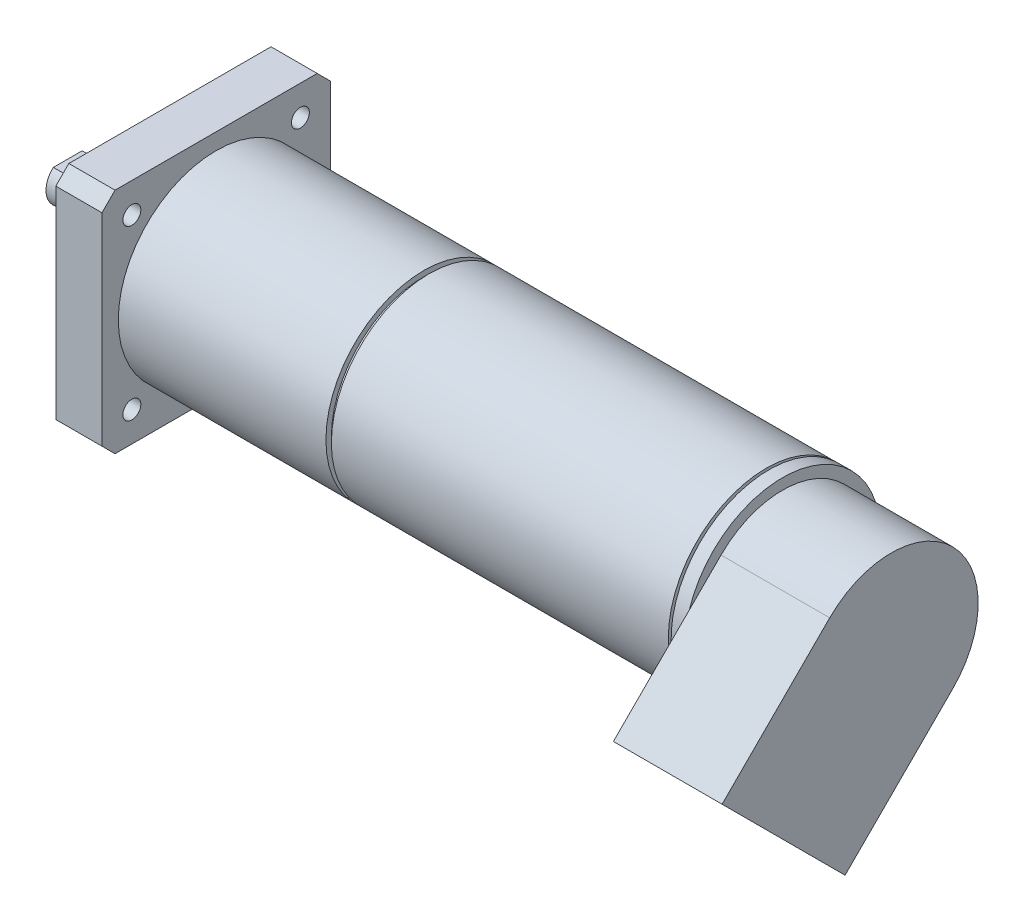
ISO-10303-21;
HEADER;
FILE_DESCRIPTION(('STEP AP214'),'2;1');
FILE_NAME('part.step','',(''),(''),'','','');
FILE_SCHEMA(('AUTOMOTIVE_DESIGN { 1 0 10303 214 1 1 1 1 }'));
ENDSEC;
DATA;
#1=APPLICATION_CONTEXT('core data for automotive mechanical design processes');
#2=APPLICATION_PROTOCOL_DEFINITION('international standard','automotive_design',2000,#1);
#3=PRODUCT_CONTEXT('',#1,'mechanical');
#4=PRODUCT('Part','Part','',(#3));
#5=PRODUCT_RELATED_PRODUCT_CATEGORY('part','',(#4));
#6=PRODUCT_DEFINITION_FORMATION('','',#4);
#7=PRODUCT_DEFINITION_CONTEXT('part definition',#1,'design');
#8=PRODUCT_DEFINITION('design','',#6,#7);
#9=PRODUCT_DEFINITION_SHAPE('','',#8);
#10=(LENGTH_UNIT() NAMED_UNIT(*) SI_UNIT(.MILLI.,.METRE.));
#11=(NAMED_UNIT(*) PLANE_ANGLE_UNIT() SI_UNIT($,.RADIAN.));
#12=(NAMED_UNIT(*) SI_UNIT($,.STERADIAN.) SOLID_ANGLE_UNIT());
#13=UNCERTAINTY_MEASURE_WITH_UNIT(LENGTH_MEASURE(1.E-05),#10,'distance_accuracy_value','');
#14=(GEOMETRIC_REPRESENTATION_CONTEXT(3) GLOBAL_UNCERTAINTY_ASSIGNED_CONTEXT((#13)) GLOBAL_UNIT_ASSIGNED_CONTEXT((#10,
#11,#12)) REPRESENTATION_CONTEXT('',''));
#15=CARTESIAN_POINT('',(0.,0.,0.));
#16=DIRECTION('',(0.,0.,1.));
#17=DIRECTION('',(1.,0.,0.));
#18=AXIS2_PLACEMENT_3D('',#15,#16,#17);
#19=CARTESIAN_POINT('',(-42.4116882454314,0.,0.));
#20=DIRECTION('',(1.,0.,0.));
#21=DIRECTION('',(0.,0.,-1.));
#22=AXIS2_PLACEMENT_3D('',#19,#20,#21);
#23=CYLINDRICAL_SURFACE('',#22,18.);
#24=CARTESIAN_POINT('',(8.5,0.,0.));
#25=DIRECTION('',(-1.,0.,0.));
#26=DIRECTION('',(0.,0.,1.));
#27=AXIS2_PLACEMENT_3D('',#24,#25,#26);
#28=CIRCLE('',#27,18.);
#29=CARTESIAN_POINT('',(8.5,0.,18.));
#30=VERTEX_POINT('',#29);
#31=EDGE_CURVE('E189',#30,#30,#28,.T.);
#32=ORIENTED_EDGE('',*,*,#31,.F.);
#33=EDGE_LOOP('',(#32));
#34=FACE_BOUND('',#33,.T.);
#35=CARTESIAN_POINT('',(46.7,0.,0.));
#36=DIRECTION('',(-1.,0.,0.));
#37=DIRECTION('',(0.,0.,1.));
#38=AXIS2_PLACEMENT_3D('',#35,#36,#37);
#39=CIRCLE('',#38,18.);
#40=CARTESIAN_POINT('',(46.7,0.,18.));
#41=VERTEX_POINT('',#40);
#42=EDGE_CURVE('E351',#41,#41,#39,.T.);
#43=ORIENTED_EDGE('',*,*,#42,.T.);
#44=EDGE_LOOP('',(#43));
#45=FACE_BOUND('',#44,.T.);
#46=ADVANCED_FACE('F39',(#34,#45),#23,.T.);
#47=CARTESIAN_POINT('',(8.5,0.,0.));
#48=DIRECTION('',(-1.,0.,0.));
#49=DIRECTION('',(0.,0.,1.));
#50=AXIS2_PLACEMENT_3D('',#47,#48,#49);
#51=PLANE('',#50);
#52=ORIENTED_EDGE('',*,*,#31,.T.);
#53=EDGE_LOOP('',(#52));
#54=FACE_BOUND('',#53,.T.);
#55=DIRECTION('',(0.,-0.70710678118655,0.707106781186545));
#56=VECTOR('',#55,1.);
#57=CARTESIAN_POINT('',(8.50000000000001,-1.12490350869764E-13,39.5979797464472));
#58=LINE('',#57,#56);
#59=CARTESIAN_POINT('',(8.50000000000001,21.,18.5979797464472));
#60=VERTEX_POINT('',#59);
#61=CARTESIAN_POINT('',(8.50000000000001,18.5979797464472,21.));
#62=VERTEX_POINT('',#61);
#63=EDGE_CURVE('E213',#60,#62,#58,.T.);
#64=ORIENTED_EDGE('',*,*,#63,.T.);
#65=DIRECTION('',(0.,-1.,0.));
#66=VECTOR('',#65,1.);
#67=CARTESIAN_POINT('',(8.5,-21.,21.));
#68=LINE('',#67,#66);
#69=CARTESIAN_POINT('',(8.50000000000001,-18.5979797464472,21.));
#70=VERTEX_POINT('',#69);
#71=EDGE_CURVE('E251',#62,#70,#68,.T.);
#72=ORIENTED_EDGE('',*,*,#71,.T.);
#73=DIRECTION('',(0.,-0.707106781186545,-0.70710678118655));
#74=VECTOR('',#73,1.);
#75=CARTESIAN_POINT('',(8.50000000000001,-1.12490350869764E-13,39.5979797464472));
#76=LINE('',#75,#74);
#77=CARTESIAN_POINT('',(8.50000000000001,-21.,18.5979797464471));
#78=VERTEX_POINT('',#77);
#79=EDGE_CURVE('E223',#70,#78,#76,.T.);
#80=ORIENTED_EDGE('',*,*,#79,.T.);
#81=DIRECTION('',(0.,0.,-1.));
#82=VECTOR('',#81,1.);
#83=CARTESIAN_POINT('',(8.5,-21.,21.));
#84=LINE('',#83,#82);
#85=CARTESIAN_POINT('',(8.50000000000001,-21.,-18.5979797464462));
#86=VERTEX_POINT('',#85);
#87=EDGE_CURVE('E254',#78,#86,#84,.T.);
#88=ORIENTED_EDGE('',*,*,#87,.T.);
#89=DIRECTION('',(0.,0.70710678118655,-0.707106781186545));
#90=VECTOR('',#89,1.);
#91=CARTESIAN_POINT('',(8.50000000000001,-39.5979797464466,3.79147973822968E-13));
#92=LINE('',#91,#90);
#93=CARTESIAN_POINT('',(8.50000000000001,-18.5979797464461,-21.));
#94=VERTEX_POINT('',#93);
#95=EDGE_CURVE('E220',#86,#94,#92,.T.);
#96=ORIENTED_EDGE('',*,*,#95,.T.);
#97=DIRECTION('',(0.,1.,0.));
#98=VECTOR('',#97,1.);
#99=CARTESIAN_POINT('',(8.5,-21.,-21.));
#100=LINE('',#99,#98);
#101=CARTESIAN_POINT('',(8.50000000000001,18.5979797464461,-21.));
#102=VERTEX_POINT('',#101);
#103=EDGE_CURVE('E244',#94,#102,#100,.T.);
#104=ORIENTED_EDGE('',*,*,#103,.T.);
#105=DIRECTION('',(0.,0.707106781186545,0.70710678118655));
#106=VECTOR('',#105,1.);
#107=CARTESIAN_POINT('',(8.50000000000001,39.5979797464467,6.61686111763116E-13));
#108=LINE('',#107,#106);
#109=CARTESIAN_POINT('',(8.50000000000001,21.,-18.5979797464461));
#110=VERTEX_POINT('',#109);
#111=EDGE_CURVE('E216',#102,#110,#108,.T.);
#112=ORIENTED_EDGE('',*,*,#111,.T.);
#113=DIRECTION('',(0.,0.,1.));
#114=VECTOR('',#113,1.);
#115=CARTESIAN_POINT('',(8.5,21.,21.));
#116=LINE('',#115,#114);
#117=EDGE_CURVE('E247',#110,#60,#116,.T.);
#118=ORIENTED_EDGE('',*,*,#117,.T.);
#119=EDGE_LOOP('',(#64,#72,#80,#88,#96,#104,#112,#118));
#120=FACE_BOUND('',#119,.T.);
#121=CARTESIAN_POINT('',(8.5,15.5,-15.5));
#122=DIRECTION('',(-1.,0.,0.));
#123=DIRECTION('',(0.,0.,1.));
#124=AXIS2_PLACEMENT_3D('',#121,#122,#123);
#125=CIRCLE('',#124,1.65);
#126=CARTESIAN_POINT('',(8.5,15.5,-13.85));
#127=VERTEX_POINT('',#126);
#128=EDGE_CURVE('E380',#127,#127,#125,.F.);
#129=ORIENTED_EDGE('',*,*,#128,.F.);
#130=EDGE_LOOP('',(#129));
#131=FACE_BOUND('',#130,.T.);
#132=CARTESIAN_POINT('',(8.5,-15.5,-15.5));
#133=DIRECTION('',(-1.,0.,0.));
#134=DIRECTION('',(0.,0.,1.));
#135=AXIS2_PLACEMENT_3D('',#132,#133,#134);
#136=CIRCLE('',#135,1.64999999999999);
#137=CARTESIAN_POINT('',(8.5,-15.5,-13.85));
#138=VERTEX_POINT('',#137);
#139=EDGE_CURVE('E374',#138,#138,#136,.F.);
#140=ORIENTED_EDGE('',*,*,#139,.F.);
#141=EDGE_LOOP('',(#140));
#142=FACE_BOUND('',#141,.T.);
#143=CARTESIAN_POINT('',(8.5,15.5,15.5));
#144=DIRECTION('',(-1.,0.,0.));
#145=DIRECTION('',(0.,0.,1.));
#146=AXIS2_PLACEMENT_3D('',#143,#144,#145);
#147=CIRCLE('',#146,1.64999999999999);
#148=CARTESIAN_POINT('',(8.5,15.5,17.15));
#149=VERTEX_POINT('',#148);
#150=EDGE_CURVE('E368',#149,#149,#147,.F.);
#151=ORIENTED_EDGE('',*,*,#150,.F.);
#152=EDGE_LOOP('',(#151));
#153=FACE_BOUND('',#152,.T.);
#154=CARTESIAN_POINT('',(8.5,-15.5,15.5));
#155=DIRECTION('',(-1.,0.,0.));
#156=DIRECTION('',(0.,0.,1.));
#157=AXIS2_PLACEMENT_3D('',#154,#155,#156);
#158=CIRCLE('',#157,1.64999999999999);
#159=CARTESIAN_POINT('',(8.5,-15.5,17.15));
#160=VERTEX_POINT('',#159);
#161=EDGE_CURVE('E362',#160,#160,#158,.F.);
#162=ORIENTED_EDGE('',*,*,#161,.F.);
#163=EDGE_LOOP('',(#162));
#164=FACE_BOUND('',#163,.T.);
#165=ADVANCED_FACE('F291',(#54,#120,#131,#142,#153,#164),#51,.F.);
#166=CARTESIAN_POINT('',(8.5,-21.,-21.));
#167=DIRECTION('',(0.,0.,1.));
#168=DIRECTION('',(1.,0.,0.));
#169=AXIS2_PLACEMENT_3D('',#166,#167,#168);
#170=PLANE('',#169);
#171=DIRECTION('',(-1.,0.,0.));
#172=VECTOR('',#171,1.);
#173=CARTESIAN_POINT('',(8.5,18.5979797464461,-21.));
#174=LINE('',#173,#172);
#175=CARTESIAN_POINT('',(0.,18.5979797464461,-21.));
#176=VERTEX_POINT('',#175);
#177=EDGE_CURVE('E237',#102,#176,#174,.T.);
#178=ORIENTED_EDGE('',*,*,#177,.F.);
#179=ORIENTED_EDGE('',*,*,#103,.F.);
#180=DIRECTION('',(1.,0.,0.));
#181=VECTOR('',#180,1.);
#182=CARTESIAN_POINT('',(8.5,-18.5979797464461,-21.));
#183=LINE('',#182,#181);
#184=CARTESIAN_POINT('',(0.,-18.5979797464461,-21.));
#185=VERTEX_POINT('',#184);
#186=EDGE_CURVE('E233',#185,#94,#183,.T.);
#187=ORIENTED_EDGE('',*,*,#186,.F.);
#188=DIRECTION('',(0.,1.,0.));
#189=VECTOR('',#188,1.);
#190=CARTESIAN_POINT('',(0.,-21.,-21.));
#191=LINE('',#190,#189);
#192=EDGE_CURVE('E243',#185,#176,#191,.T.);
#193=ORIENTED_EDGE('',*,*,#192,.T.);
#194=EDGE_LOOP('',(#178,#179,#187,#193));
#195=FACE_BOUND('',#194,.T.);
#196=ADVANCED_FACE('F41',(#195),#170,.F.);
#197=CARTESIAN_POINT('',(8.5,21.,21.));
#198=DIRECTION('',(0.,-1.,0.));
#199=DIRECTION('',(0.,0.,-1.));
#200=AXIS2_PLACEMENT_3D('',#197,#198,#199);
#201=PLANE('',#200);
#202=DIRECTION('',(-1.,0.,0.));
#203=VECTOR('',#202,1.);
#204=CARTESIAN_POINT('',(8.5,21.,18.5979797464472));
#205=LINE('',#204,#203);
#206=CARTESIAN_POINT('',(0.,21.,18.5979797464472));
#207=VERTEX_POINT('',#206);
#208=EDGE_CURVE('E241',#60,#207,#205,.T.);
#209=ORIENTED_EDGE('',*,*,#208,.F.);
#210=ORIENTED_EDGE('',*,*,#117,.F.);
#211=DIRECTION('',(1.,0.,0.));
#212=VECTOR('',#211,1.);
#213=CARTESIAN_POINT('',(8.5,21.,-18.5979797464461));
#214=LINE('',#213,#212);
#215=CARTESIAN_POINT('',(0.,21.,-18.5979797464461));
#216=VERTEX_POINT('',#215);
#217=EDGE_CURVE('E235',#216,#110,#214,.T.);
#218=ORIENTED_EDGE('',*,*,#217,.F.);
#219=DIRECTION('',(0.,0.,1.));
#220=VECTOR('',#219,1.);
#221=CARTESIAN_POINT('',(0.,21.,21.));
#222=LINE('',#221,#220);
#223=EDGE_CURVE('E260',#216,#207,#222,.T.);
#224=ORIENTED_EDGE('',*,*,#223,.T.);
#225=EDGE_LOOP('',(#209,#210,#218,#224));
#226=FACE_BOUND('',#225,.T.);
#227=ADVANCED_FACE('F285',(#226),#201,.F.);
#228=CARTESIAN_POINT('',(8.5,-21.,21.));
#229=DIRECTION('',(0.,0.,-1.));
#230=DIRECTION('',(-1.,0.,0.));
#231=AXIS2_PLACEMENT_3D('',#228,#229,#230);
#232=PLANE('',#231);
#233=DIRECTION('',(1.,0.,0.));
#234=VECTOR('',#233,1.);
#235=CARTESIAN_POINT('',(8.5,18.5979797464472,21.));
#236=LINE('',#235,#234);
#237=CARTESIAN_POINT('',(0.,18.5979797464472,21.));
#238=VERTEX_POINT('',#237);
#239=EDGE_CURVE('E239',#238,#62,#236,.T.);
#240=ORIENTED_EDGE('',*,*,#239,.F.);
#241=DIRECTION('',(0.,-1.,0.));
#242=VECTOR('',#241,1.);
#243=CARTESIAN_POINT('',(0.,-21.,21.));
#244=LINE('',#243,#242);
#245=CARTESIAN_POINT('',(0.,-18.5979797464472,21.));
#246=VERTEX_POINT('',#245);
#247=EDGE_CURVE('E263',#238,#246,#244,.T.);
#248=ORIENTED_EDGE('',*,*,#247,.T.);
#249=DIRECTION('',(-1.,0.,0.));
#250=VECTOR('',#249,1.);
#251=CARTESIAN_POINT('',(8.5,-18.5979797464472,21.));
#252=LINE('',#251,#250);
#253=EDGE_CURVE('E229',#70,#246,#252,.T.);
#254=ORIENTED_EDGE('',*,*,#253,.F.);
#255=ORIENTED_EDGE('',*,*,#71,.F.);
#256=EDGE_LOOP('',(#240,#248,#254,#255));
#257=FACE_BOUND('',#256,.T.);
#258=ADVANCED_FACE('F308',(#257),#232,.F.);
#259=CARTESIAN_POINT('',(8.5,-21.,21.));
#260=DIRECTION('',(0.,1.,0.));
#261=DIRECTION('',(0.,0.,1.));
#262=AXIS2_PLACEMENT_3D('',#259,#260,#261);
#263=PLANE('',#262);
#264=DIRECTION('',(-1.,0.,0.));
#265=VECTOR('',#264,1.);
#266=CARTESIAN_POINT('',(8.5,-21.,-18.5979797464461));
#267=LINE('',#266,#265);
#268=CARTESIAN_POINT('',(0.,-21.,-18.5979797464461));
#269=VERTEX_POINT('',#268);
#270=EDGE_CURVE('E231',#86,#269,#267,.T.);
#271=ORIENTED_EDGE('',*,*,#270,.F.);
#272=ORIENTED_EDGE('',*,*,#87,.F.);
#273=DIRECTION('',(1.,0.,0.));
#274=VECTOR('',#273,1.);
#275=CARTESIAN_POINT('',(8.5,-21.,18.5979797464471));
#276=LINE('',#275,#274);
#277=CARTESIAN_POINT('',(0.,-21.,18.5979797464471));
#278=VERTEX_POINT('',#277);
#279=EDGE_CURVE('E219',#278,#78,#276,.T.);
#280=ORIENTED_EDGE('',*,*,#279,.F.);
#281=DIRECTION('',(0.,0.,-1.));
#282=VECTOR('',#281,1.);
#283=CARTESIAN_POINT('',(0.,-21.,21.));
#284=LINE('',#283,#282);
#285=EDGE_CURVE('E248',#278,#269,#284,.T.);
#286=ORIENTED_EDGE('',*,*,#285,.T.);
#287=EDGE_LOOP('',(#271,#272,#280,#286));
#288=FACE_BOUND('',#287,.T.);
#289=ADVANCED_FACE('F301',(#288),#263,.F.);
#290=CARTESIAN_POINT('',(0.,0.,0.));
#291=DIRECTION('',(-1.,0.,0.));
#292=DIRECTION('',(0.,0.,1.));
#293=AXIS2_PLACEMENT_3D('',#290,#291,#292);
#294=PLANE('',#293);
#295=CARTESIAN_POINT('',(0.,-15.5,15.5));
#296=DIRECTION('',(-1.,0.,0.));
#297=DIRECTION('',(0.,0.,1.));
#298=AXIS2_PLACEMENT_3D('',#295,#296,#297);
#299=CIRCLE('',#298,1.64999999999999);
#300=CARTESIAN_POINT('',(0.,-15.5,17.15));
#301=VERTEX_POINT('',#300);
#302=EDGE_CURVE('E361',#301,#301,#299,.T.);
#303=ORIENTED_EDGE('',*,*,#302,.F.);
#304=EDGE_LOOP('',(#303));
#305=FACE_BOUND('',#304,.T.);
#306=CARTESIAN_POINT('',(0.,15.5,15.5));
#307=DIRECTION('',(-1.,0.,0.));
#308=DIRECTION('',(0.,0.,1.));
#309=AXIS2_PLACEMENT_3D('',#306,#307,#308);
#310=CIRCLE('',#309,1.64999999999999);
#311=CARTESIAN_POINT('',(0.,15.5,17.15));
#312=VERTEX_POINT('',#311);
#313=EDGE_CURVE('E365',#312,#312,#310,.T.);
#314=ORIENTED_EDGE('',*,*,#313,.F.);
#315=EDGE_LOOP('',(#314));
#316=FACE_BOUND('',#315,.T.);
#317=CARTESIAN_POINT('',(0.,-15.5,-15.5));
#318=DIRECTION('',(-1.,0.,0.));
#319=DIRECTION('',(0.,0.,1.));
#320=AXIS2_PLACEMENT_3D('',#317,#318,#319);
#321=CIRCLE('',#320,1.64999999999999);
#322=CARTESIAN_POINT('',(0.,-15.5,-13.85));
#323=VERTEX_POINT('',#322);
#324=EDGE_CURVE('E371',#323,#323,#321,.T.);
#325=ORIENTED_EDGE('',*,*,#324,.F.);
#326=EDGE_LOOP('',(#325));
#327=FACE_BOUND('',#326,.T.);
#328=CARTESIAN_POINT('',(0.,15.5,-15.5));
#329=DIRECTION('',(-1.,0.,0.));
#330=DIRECTION('',(0.,0.,1.));
#331=AXIS2_PLACEMENT_3D('',#328,#329,#330);
#332=CIRCLE('',#331,1.64999999999999);
#333=CARTESIAN_POINT('',(0.,15.5,-13.85));
#334=VERTEX_POINT('',#333);
#335=EDGE_CURVE('E377',#334,#334,#332,.T.);
#336=ORIENTED_EDGE('',*,*,#335,.F.);
#337=EDGE_LOOP('',(#336));
#338=FACE_BOUND('',#337,.T.);
#339=CARTESIAN_POINT('',(0.,0.,0.));
#340=DIRECTION('',(-1.,0.,0.));
#341=DIRECTION('',(0.,0.,1.));
#342=AXIS2_PLACEMENT_3D('',#339,#340,#341);
#343=CIRCLE('',#342,11.);
#344=CARTESIAN_POINT('',(0.,0.,11.));
#345=VERTEX_POINT('',#344);
#346=EDGE_CURVE('E210',#345,#345,#343,.T.);
#347=ORIENTED_EDGE('',*,*,#346,.F.);
#348=EDGE_LOOP('',(#347));
#349=FACE_BOUND('',#348,.T.);
#350=ORIENTED_EDGE('',*,*,#247,.F.);
#351=DIRECTION('',(0.,0.70710678118655,-0.707106781186545));
#352=VECTOR('',#351,1.);
#353=CARTESIAN_POINT('',(0.,19.7989898732235,19.7989898732237));
#354=LINE('',#353,#352);
#355=EDGE_CURVE('E43',#238,#207,#354,.T.);
#356=ORIENTED_EDGE('',*,*,#355,.T.);
#357=ORIENTED_EDGE('',*,*,#223,.F.);
#358=DIRECTION('',(0.,-0.707106781186545,-0.70710678118655));
#359=VECTOR('',#358,1.);
#360=CARTESIAN_POINT('',(0.,19.7989898732231,-19.798989873223));
#361=LINE('',#360,#359);
#362=EDGE_CURVE('E272',#216,#176,#361,.T.);
#363=ORIENTED_EDGE('',*,*,#362,.T.);
#364=ORIENTED_EDGE('',*,*,#192,.F.);
#365=DIRECTION('',(0.,-0.70710678118655,0.707106781186545));
#366=VECTOR('',#365,1.);
#367=CARTESIAN_POINT('',(0.,-19.798989873223,-19.7989898732231));
#368=LINE('',#367,#366);
#369=EDGE_CURVE('E270',#185,#269,#368,.T.);
#370=ORIENTED_EDGE('',*,*,#369,.T.);
#371=ORIENTED_EDGE('',*,*,#285,.F.);
#372=DIRECTION('',(0.,0.707106781186545,0.70710678118655));
#373=VECTOR('',#372,1.);
#374=CARTESIAN_POINT('',(0.,-19.7989898732236,19.7989898732235));
#375=LINE('',#374,#373);
#376=EDGE_CURVE('E257',#278,#246,#375,.T.);
#377=ORIENTED_EDGE('',*,*,#376,.T.);
#378=EDGE_LOOP('',(#350,#356,#357,#363,#364,#370,#371,#377));
#379=FACE_BOUND('',#378,.T.);
#380=ADVANCED_FACE('F279',(#305,#316,#327,#338,#349,#379),#294,.T.);
#381=CARTESIAN_POINT('',(142.025240081701,-1.12490350869764E-13,39.5979797464472));
#382=DIRECTION('',(0.,-0.70710678118655,0.707106781186545));
#383=DIRECTION('',(0.,-0.707106781186545,-0.70710678118655));
#384=AXIS2_PLACEMENT_3D('',#381,#382,#383);
#385=PLANE('',#384);
#386=ORIENTED_EDGE('',*,*,#253,.T.);
#387=ORIENTED_EDGE('',*,*,#376,.F.);
#388=ORIENTED_EDGE('',*,*,#279,.T.);
#389=ORIENTED_EDGE('',*,*,#79,.F.);
#390=EDGE_LOOP('',(#386,#387,#388,#389));
#391=FACE_BOUND('',#390,.T.);
#392=ADVANCED_FACE('F304',(#391),#385,.T.);
#393=CARTESIAN_POINT('',(142.025240081701,-39.5979797464466,3.79147973822968E-13));
#394=DIRECTION('',(0.,-0.707106781186545,-0.70710678118655));
#395=DIRECTION('',(0.,0.70710678118655,-0.707106781186545));
#396=AXIS2_PLACEMENT_3D('',#393,#394,#395);
#397=PLANE('',#396);
#398=ORIENTED_EDGE('',*,*,#186,.T.);
#399=ORIENTED_EDGE('',*,*,#95,.F.);
#400=ORIENTED_EDGE('',*,*,#270,.T.);
#401=ORIENTED_EDGE('',*,*,#369,.F.);
#402=EDGE_LOOP('',(#398,#399,#400,#401));
#403=FACE_BOUND('',#402,.T.);
#404=ADVANCED_FACE('F320',(#403),#397,.T.);
#405=CARTESIAN_POINT('',(142.025240081701,39.5979797464467,6.61686111763116E-13));
#406=DIRECTION('',(0.,0.70710678118655,-0.707106781186545));
#407=DIRECTION('',(0.,0.707106781186545,0.70710678118655));
#408=AXIS2_PLACEMENT_3D('',#405,#406,#407);
#409=PLANE('',#408);
#410=ORIENTED_EDGE('',*,*,#177,.T.);
#411=ORIENTED_EDGE('',*,*,#362,.F.);
#412=ORIENTED_EDGE('',*,*,#217,.T.);
#413=ORIENTED_EDGE('',*,*,#111,.F.);
#414=EDGE_LOOP('',(#410,#411,#412,#413));
#415=FACE_BOUND('',#414,.T.);
#416=ADVANCED_FACE('F288',(#415),#409,.T.);
#417=CARTESIAN_POINT('',(142.025240081701,-1.12490350869764E-13,39.5979797464472));
#418=DIRECTION('',(0.,0.707106781186545,0.70710678118655));
#419=DIRECTION('',(0.,-0.70710678118655,0.707106781186545));
#420=AXIS2_PLACEMENT_3D('',#417,#418,#419);
#421=PLANE('',#420);
#422=ORIENTED_EDGE('',*,*,#208,.T.);
#423=ORIENTED_EDGE('',*,*,#355,.F.);
#424=ORIENTED_EDGE('',*,*,#239,.T.);
#425=ORIENTED_EDGE('',*,*,#63,.F.);
#426=EDGE_LOOP('',(#422,#423,#424,#425));
#427=FACE_BOUND('',#426,.T.);
#428=ADVANCED_FACE('F309',(#427),#421,.T.);
#429=CARTESIAN_POINT('',(-2.,0.,0.));
#430=DIRECTION('',(1.,0.,0.));
#431=DIRECTION('',(0.,0.,-1.));
#432=AXIS2_PLACEMENT_3D('',#429,#430,#431);
#433=CYLINDRICAL_SURFACE('',#432,11.);
#434=CARTESIAN_POINT('',(-2.,0.,0.));
#435=DIRECTION('',(-1.,0.,0.));
#436=DIRECTION('',(0.,0.,1.));
#437=AXIS2_PLACEMENT_3D('',#434,#435,#436);
#438=CIRCLE('',#437,11.);
#439=CARTESIAN_POINT('',(-2.,0.,11.));
#440=VERTEX_POINT('',#439);
#441=EDGE_CURVE('E207',#440,#440,#438,.T.);
#442=ORIENTED_EDGE('',*,*,#441,.F.);
#443=EDGE_LOOP('',(#442));
#444=FACE_BOUND('',#443,.T.);
#445=ORIENTED_EDGE('',*,*,#346,.T.);
#446=EDGE_LOOP('',(#445));
#447=FACE_BOUND('',#446,.T.);
#448=ADVANCED_FACE('F311',(#444,#447),#433,.T.);
#449=CARTESIAN_POINT('',(-2.,0.,0.));
#450=DIRECTION('',(-1.,0.,0.));
#451=DIRECTION('',(0.,0.,1.));
#452=AXIS2_PLACEMENT_3D('',#449,#450,#451);
#453=PLANE('',#452);
#454=CARTESIAN_POINT('',(-2.,0.,0.));
#455=DIRECTION('',(-1.,0.,0.));
#456=DIRECTION('',(0.,0.,1.));
#457=AXIS2_PLACEMENT_3D('',#454,#455,#456);
#458=CIRCLE('',#457,4.);
#459=CARTESIAN_POINT('',(-2.,0.,4.));
#460=VERTEX_POINT('',#459);
#461=EDGE_CURVE('E186',#460,#460,#458,.T.);
#462=ORIENTED_EDGE('',*,*,#461,.F.);
#463=EDGE_LOOP('',(#462));
#464=FACE_BOUND('',#463,.T.);
#465=ORIENTED_EDGE('',*,*,#441,.T.);
#466=EDGE_LOOP('',(#465));
#467=FACE_BOUND('',#466,.T.);
#468=ADVANCED_FACE('F317',(#464,#467),#453,.T.);
#469=CARTESIAN_POINT('',(-18.8,0.,0.));
#470=DIRECTION('',(1.,0.,0.));
#471=DIRECTION('',(0.,0.,-1.));
#472=AXIS2_PLACEMENT_3D('',#469,#470,#471);
#473=CYLINDRICAL_SURFACE('',#472,4.);
#474=CARTESIAN_POINT('',(-18.8,0.,0.));
#475=DIRECTION('',(-1.,0.,0.));
#476=DIRECTION('',(0.,0.,1.));
#477=AXIS2_PLACEMENT_3D('',#474,#475,#476);
#478=CIRCLE('',#477,4.);
#479=CARTESIAN_POINT('',(-18.8,3.,-2.64575131106459));
#480=VERTEX_POINT('',#479);
#481=CARTESIAN_POINT('',(-18.8,3.,2.64575131106459));
#482=VERTEX_POINT('',#481);
#483=EDGE_CURVE('E203',#480,#482,#478,.T.);
#484=ORIENTED_EDGE('',*,*,#483,.F.);
#485=DIRECTION('',(-1.,0.,0.));
#486=VECTOR('',#485,1.);
#487=CARTESIAN_POINT('',(-3.8,3.,-2.64575131106459));
#488=LINE('',#487,#486);
#489=CARTESIAN_POINT('',(-3.8,3.,-2.64575131106459));
#490=VERTEX_POINT('',#489);
#491=EDGE_CURVE('E198',#490,#480,#488,.T.);
#492=ORIENTED_EDGE('',*,*,#491,.F.);
#493=CARTESIAN_POINT('',(-3.8,0.,0.));
#494=DIRECTION('',(-1.,0.,0.));
#495=DIRECTION('',(0.,0.,1.));
#496=AXIS2_PLACEMENT_3D('',#493,#494,#495);
#497=CIRCLE('',#496,4.);
#498=CARTESIAN_POINT('',(-3.8,3.,2.64575131106459));
#499=VERTEX_POINT('',#498);
#500=EDGE_CURVE('E193',#499,#490,#497,.T.);
#501=ORIENTED_EDGE('',*,*,#500,.F.);
#502=DIRECTION('',(-1.,0.,0.));
#503=VECTOR('',#502,1.);
#504=CARTESIAN_POINT('',(-3.8,3.,2.64575131106459));
#505=LINE('',#504,#503);
#506=EDGE_CURVE('E200',#499,#482,#505,.T.);
#507=ORIENTED_EDGE('',*,*,#506,.T.);
#508=EDGE_LOOP('',(#484,#492,#501,#507));
#509=FACE_BOUND('',#508,.T.);
#510=ORIENTED_EDGE('',*,*,#461,.T.);
#511=EDGE_LOOP('',(#510));
#512=FACE_BOUND('',#511,.T.);
#513=ADVANCED_FACE('F472',(#509,#512),#473,.T.);
#514=CARTESIAN_POINT('',(-18.8,0.,0.));
#515=DIRECTION('',(-1.,0.,0.));
#516=DIRECTION('',(0.,0.,1.));
#517=AXIS2_PLACEMENT_3D('',#514,#515,#516);
#518=PLANE('',#517);
#519=DIRECTION('',(0.,0.,1.));
#520=VECTOR('',#519,1.);
#521=CARTESIAN_POINT('',(-18.8,3.,-2.64575131106459));
#522=LINE('',#521,#520);
#523=EDGE_CURVE('E192',#480,#482,#522,.T.);
#524=ORIENTED_EDGE('',*,*,#523,.F.);
#525=ORIENTED_EDGE('',*,*,#483,.T.);
#526=EDGE_LOOP('',(#524,#525));
#527=FACE_BOUND('',#526,.T.);
#528=ADVANCED_FACE('F462',(#527),#518,.T.);
#529=CARTESIAN_POINT('',(-3.8,3.,-2.64575131106459));
#530=DIRECTION('',(0.,-1.,0.));
#531=DIRECTION('',(0.,0.,-1.));
#532=AXIS2_PLACEMENT_3D('',#529,#530,#531);
#533=PLANE('',#532);
#534=ORIENTED_EDGE('',*,*,#523,.T.);
#535=ORIENTED_EDGE('',*,*,#506,.F.);
#536=DIRECTION('',(0.,0.,1.));
#537=VECTOR('',#536,1.);
#538=CARTESIAN_POINT('',(-3.8,3.,-2.64575131106459));
#539=LINE('',#538,#537);
#540=EDGE_CURVE('E195',#490,#499,#539,.T.);
#541=ORIENTED_EDGE('',*,*,#540,.F.);
#542=ORIENTED_EDGE('',*,*,#491,.T.);
#543=EDGE_LOOP('',(#534,#535,#541,#542));
#544=FACE_BOUND('',#543,.T.);
#545=ADVANCED_FACE('F452',(#544),#533,.F.);
#546=CARTESIAN_POINT('',(-3.8,0.,0.));
#547=DIRECTION('',(-1.,0.,0.));
#548=DIRECTION('',(0.,0.,1.));
#549=AXIS2_PLACEMENT_3D('',#546,#547,#548);
#550=PLANE('',#549);
#551=ORIENTED_EDGE('',*,*,#500,.T.);
#552=ORIENTED_EDGE('',*,*,#540,.T.);
#553=EDGE_LOOP('',(#551,#552));
#554=FACE_BOUND('',#553,.T.);
#555=ADVANCED_FACE('F447',(#554),#550,.T.);
#556=CARTESIAN_POINT('',(0.,15.5,-15.5));
#557=DIRECTION('',(-1.,0.,0.));
#558=DIRECTION('',(0.,0.,1.));
#559=AXIS2_PLACEMENT_3D('',#556,#557,#558);
#560=CYLINDRICAL_SURFACE('',#559,1.65);
#561=ORIENTED_EDGE('',*,*,#128,.T.);
#562=EDGE_LOOP('',(#561));
#563=FACE_BOUND('',#562,.T.);
#564=ORIENTED_EDGE('',*,*,#335,.T.);
#565=EDGE_LOOP('',(#564));
#566=FACE_BOUND('',#565,.T.);
#567=ADVANCED_FACE('F451',(#563,#566),#560,.F.);
#568=CARTESIAN_POINT('',(0.,-15.5,-15.5));
#569=DIRECTION('',(-1.,0.,0.));
#570=DIRECTION('',(0.,0.,1.));
#571=AXIS2_PLACEMENT_3D('',#568,#569,#570);
#572=CYLINDRICAL_SURFACE('',#571,1.64999999999999);
#573=ORIENTED_EDGE('',*,*,#139,.T.);
#574=EDGE_LOOP('',(#573));
#575=FACE_BOUND('',#574,.T.);
#576=ORIENTED_EDGE('',*,*,#324,.T.);
#577=EDGE_LOOP('',(#576));
#578=FACE_BOUND('',#577,.T.);
#579=ADVANCED_FACE('F580',(#575,#578),#572,.F.);
#580=CARTESIAN_POINT('',(0.,15.5,15.5));
#581=DIRECTION('',(-1.,0.,0.));
#582=DIRECTION('',(0.,0.,1.));
#583=AXIS2_PLACEMENT_3D('',#580,#581,#582);
#584=CYLINDRICAL_SURFACE('',#583,1.64999999999999);
#585=ORIENTED_EDGE('',*,*,#150,.T.);
#586=EDGE_LOOP('',(#585));
#587=FACE_BOUND('',#586,.T.);
#588=ORIENTED_EDGE('',*,*,#313,.T.);
#589=EDGE_LOOP('',(#588));
#590=FACE_BOUND('',#589,.T.);
#591=ADVANCED_FACE('F585',(#587,#590),#584,.F.);
#592=CARTESIAN_POINT('',(0.,-15.5,15.5));
#593=DIRECTION('',(-1.,0.,0.));
#594=DIRECTION('',(0.,0.,1.));
#595=AXIS2_PLACEMENT_3D('',#592,#593,#594);
#596=CYLINDRICAL_SURFACE('',#595,1.64999999999999);
#597=ORIENTED_EDGE('',*,*,#161,.T.);
#598=EDGE_LOOP('',(#597));
#599=FACE_BOUND('',#598,.T.);
#600=ORIENTED_EDGE('',*,*,#302,.T.);
#601=EDGE_LOOP('',(#600));
#602=FACE_BOUND('',#601,.T.);
#603=ADVANCED_FACE('F598',(#599,#602),#596,.F.);
#604=CARTESIAN_POINT('',(46.7,0.,-18.));
#605=DIRECTION('',(1.,0.,0.));
#606=DIRECTION('',(0.,0.,-1.));
#607=AXIS2_PLACEMENT_3D('',#604,#605,#606);
#608=PLANE('',#607);
#609=CARTESIAN_POINT('',(46.7,0.,0.));
#610=DIRECTION('',(-1.,0.,0.));
#611=DIRECTION('',(0.,0.,1.));
#612=AXIS2_PLACEMENT_3D('',#609,#610,#611);
#613=CIRCLE('',#612,17.);
#614=CARTESIAN_POINT('',(46.7,0.,17.));
#615=VERTEX_POINT('',#614);
#616=EDGE_CURVE('E354',#615,#615,#613,.T.);
#617=ORIENTED_EDGE('',*,*,#616,.T.);
#618=EDGE_LOOP('',(#617));
#619=FACE_BOUND('',#618,.T.);
#620=ORIENTED_EDGE('',*,*,#42,.F.);
#621=EDGE_LOOP('',(#620));
#622=FACE_BOUND('',#621,.T.);
#623=ADVANCED_FACE('F609',(#619,#622),#608,.T.);
#624=CARTESIAN_POINT('',(8.49999999999999,0.,0.));
#625=DIRECTION('',(-1.,0.,0.));
#626=DIRECTION('',(0.,0.,1.));
#627=AXIS2_PLACEMENT_3D('',#624,#625,#626);
#628=CYLINDRICAL_SURFACE('',#627,17.);
#629=CARTESIAN_POINT('',(47.7,0.,0.));
#630=DIRECTION('',(-1.,0.,0.));
#631=DIRECTION('',(0.,0.,1.));
#632=AXIS2_PLACEMENT_3D('',#629,#630,#631);
#633=CIRCLE('',#632,17.);
#634=CARTESIAN_POINT('',(47.7,0.,17.));
#635=VERTEX_POINT('',#634);
#636=EDGE_CURVE('E350',#635,#635,#633,.T.);
#637=ORIENTED_EDGE('',*,*,#636,.T.);
#638=EDGE_LOOP('',(#637));
#639=FACE_BOUND('',#638,.T.);
#640=ORIENTED_EDGE('',*,*,#616,.F.);
#641=EDGE_LOOP('',(#640));
#642=FACE_BOUND('',#641,.T.);
#643=ADVANCED_FACE('F628',(#639,#642),#628,.T.);
#644=CARTESIAN_POINT('',(47.7,0.,-18.));
#645=DIRECTION('',(-1.,0.,0.));
#646=DIRECTION('',(0.,0.,1.));
#647=AXIS2_PLACEMENT_3D('',#644,#645,#646);
#648=PLANE('',#647);
#649=CARTESIAN_POINT('',(47.7,0.,0.));
#650=DIRECTION('',(-1.,0.,0.));
#651=DIRECTION('',(0.,0.,1.));
#652=AXIS2_PLACEMENT_3D('',#649,#650,#651);
#653=CIRCLE('',#652,18.);
#654=CARTESIAN_POINT('',(47.7,0.,18.));
#655=VERTEX_POINT('',#654);
#656=EDGE_CURVE('E348',#655,#655,#653,.T.);
#657=ORIENTED_EDGE('',*,*,#656,.T.);
#658=EDGE_LOOP('',(#657));
#659=FACE_BOUND('',#658,.T.);
#660=ORIENTED_EDGE('',*,*,#636,.F.);
#661=EDGE_LOOP('',(#660));
#662=FACE_BOUND('',#661,.T.);
#663=ADVANCED_FACE('F638',(#659,#662),#648,.T.);
#664=CARTESIAN_POINT('',(132.7,0.,0.));
#665=DIRECTION('',(1.,0.,0.));
#666=DIRECTION('',(0.,0.,-1.));
#667=AXIS2_PLACEMENT_3D('',#664,#665,#666);
#668=PLANE('',#667);
#669=CARTESIAN_POINT('',(132.7,0.,0.));
#670=DIRECTION('',(1.,0.,0.));
#671=DIRECTION('',(0.,0.,-1.));
#672=AXIS2_PLACEMENT_3D('',#669,#670,#671);
#673=CIRCLE('',#672,16.);
#674=CARTESIAN_POINT('',(132.7,-11.3137084989848,-11.3137084989848));
#675=VERTEX_POINT('',#674);
#676=CARTESIAN_POINT('',(132.7,11.3137084989848,11.3137084989848));
#677=VERTEX_POINT('',#676);
#678=EDGE_CURVE('E157',#675,#677,#673,.T.);
#679=ORIENTED_EDGE('',*,*,#678,.T.);
#680=DIRECTION('',(0.,-0.707106781186548,0.707106781186547));
#681=VECTOR('',#680,1.);
#682=CARTESIAN_POINT('',(132.7,11.3137084989848,11.3137084989848));
#683=LINE('',#682,#681);
#684=CARTESIAN_POINT('',(132.7,-8.48528137423886,31.1126983722084));
#685=VERTEX_POINT('',#684);
#686=EDGE_CURVE('E147',#677,#685,#683,.T.);
#687=ORIENTED_EDGE('',*,*,#686,.T.);
#688=DIRECTION('',(0.,-0.707106781186545,-0.70710678118655));
#689=VECTOR('',#688,1.);
#690=CARTESIAN_POINT('',(132.7,-8.48528137423886,31.1126983722084));
#691=LINE('',#690,#689);
#692=CARTESIAN_POINT('',(132.7,-31.1126983722083,8.48528137423877));
#693=VERTEX_POINT('',#692);
#694=EDGE_CURVE('E156',#685,#693,#691,.T.);
#695=ORIENTED_EDGE('',*,*,#694,.T.);
#696=DIRECTION('',(0.,0.707106781186548,-0.707106781186547));
#697=VECTOR('',#696,1.);
#698=CARTESIAN_POINT('',(132.7,-31.1126983722083,8.48528137423877));
#699=LINE('',#698,#697);
#700=EDGE_CURVE('E162',#693,#675,#699,.T.);
#701=ORIENTED_EDGE('',*,*,#700,.T.);
#702=EDGE_LOOP('',(#679,#687,#695,#701));
#703=FACE_BOUND('',#702,.T.);
#704=ADVANCED_FACE('F160',(#703),#668,.T.);
#705=CARTESIAN_POINT('',(132.7,0.,0.));
#706=DIRECTION('',(-1.,0.,0.));
#707=DIRECTION('',(0.,0.,1.));
#708=AXIS2_PLACEMENT_3D('',#705,#706,#707);
#709=CYLINDRICAL_SURFACE('',#708,16.);
#710=CARTESIAN_POINT('',(112.7,0.,0.));
#711=DIRECTION('',(1.,0.,0.));
#712=DIRECTION('',(0.,0.,-1.));
#713=AXIS2_PLACEMENT_3D('',#710,#711,#712);
#714=CIRCLE('',#713,16.);
#715=CARTESIAN_POINT('',(112.7,-11.3137084989848,-11.3137084989848));
#716=VERTEX_POINT('',#715);
#717=CARTESIAN_POINT('',(112.7,11.3137084989848,11.3137084989848));
#718=VERTEX_POINT('',#717);
#719=EDGE_CURVE('E57',#716,#718,#714,.T.);
#720=ORIENTED_EDGE('',*,*,#719,.T.);
#721=DIRECTION('',(-1.,0.,0.));
#722=VECTOR('',#721,1.);
#723=CARTESIAN_POINT('',(132.7,11.3137084989848,11.3137084989848));
#724=LINE('',#723,#722);
#725=EDGE_CURVE('E151',#677,#718,#724,.T.);
#726=ORIENTED_EDGE('',*,*,#725,.F.);
#727=ORIENTED_EDGE('',*,*,#678,.F.);
#728=DIRECTION('',(-1.,0.,0.));
#729=VECTOR('',#728,1.);
#730=CARTESIAN_POINT('',(132.7,-11.3137084989848,-11.3137084989848));
#731=LINE('',#730,#729);
#732=EDGE_CURVE('E387',#675,#716,#731,.T.);
#733=ORIENTED_EDGE('',*,*,#732,.T.);
#734=EDGE_LOOP('',(#720,#726,#727,#733));
#735=FACE_BOUND('',#734,.T.);
#736=ADVANCED_FACE('F167',(#735),#709,.T.);
#737=CARTESIAN_POINT('',(132.7,-8.48528137423886,31.1126983722084));
#738=DIRECTION('',(0.,0.70710678118655,-0.707106781186545));
#739=DIRECTION('',(0.,0.707106781186545,0.70710678118655));
#740=AXIS2_PLACEMENT_3D('',#737,#738,#739);
#741=PLANE('',#740);
#742=DIRECTION('',(0.,-0.707106781186545,-0.70710678118655));
#743=VECTOR('',#742,1.);
#744=CARTESIAN_POINT('',(112.7,-8.48528137423886,31.1126983722084));
#745=LINE('',#744,#743);
#746=CARTESIAN_POINT('',(112.7,-8.48528137423886,31.1126983722084));
#747=VERTEX_POINT('',#746);
#748=CARTESIAN_POINT('',(112.7,-31.1126983722083,8.48528137423877));
#749=VERTEX_POINT('',#748);
#750=EDGE_CURVE('E391',#747,#749,#745,.T.);
#751=ORIENTED_EDGE('',*,*,#750,.T.);
#752=DIRECTION('',(-1.,0.,0.));
#753=VECTOR('',#752,1.);
#754=CARTESIAN_POINT('',(132.7,-31.1126983722083,8.48528137423877));
#755=LINE('',#754,#753);
#756=EDGE_CURVE('E173',#693,#749,#755,.T.);
#757=ORIENTED_EDGE('',*,*,#756,.F.);
#758=ORIENTED_EDGE('',*,*,#694,.F.);
#759=DIRECTION('',(-1.,0.,0.));
#760=VECTOR('',#759,1.);
#761=CARTESIAN_POINT('',(132.7,-8.48528137423886,31.1126983722084));
#762=LINE('',#761,#760);
#763=EDGE_CURVE('E153',#685,#747,#762,.T.);
#764=ORIENTED_EDGE('',*,*,#763,.T.);
#765=EDGE_LOOP('',(#751,#757,#758,#764));
#766=FACE_BOUND('',#765,.T.);
#767=ADVANCED_FACE('F690',(#766),#741,.F.);
#768=CARTESIAN_POINT('',(132.7,-31.1126983722083,8.48528137423877));
#769=DIRECTION('',(0.,0.707106781186547,0.707106781186548));
#770=DIRECTION('',(0.,-0.707106781186548,0.707106781186547));
#771=AXIS2_PLACEMENT_3D('',#768,#769,#770);
#772=PLANE('',#771);
#773=DIRECTION('',(0.,0.707106781186548,-0.707106781186547));
#774=VECTOR('',#773,1.);
#775=CARTESIAN_POINT('',(112.7,-31.1126983722083,8.48528137423877));
#776=LINE('',#775,#774);
#777=CARTESIAN_POINT('',(112.7,-17.1446603938301,-5.48275660413945));
#778=VERTEX_POINT('',#777);
#779=EDGE_CURVE('E50',#749,#778,#776,.T.);
#780=ORIENTED_EDGE('',*,*,#779,.T.);
#781=EDGE_CURVE('E11',#778,#716,#776,.T.);
#782=ORIENTED_EDGE('',*,*,#781,.T.);
#783=ORIENTED_EDGE('',*,*,#732,.F.);
#784=ORIENTED_EDGE('',*,*,#700,.F.);
#785=ORIENTED_EDGE('',*,*,#756,.T.);
#786=EDGE_LOOP('',(#780,#782,#783,#784,#785));
#787=FACE_BOUND('',#786,.T.);
#788=ADVANCED_FACE('F398',(#787),#772,.F.);
#789=CARTESIAN_POINT('',(132.7,11.3137084989848,11.3137084989848));
#790=DIRECTION('',(0.,-0.707106781186547,-0.707106781186548));
#791=DIRECTION('',(0.,0.707106781186548,-0.707106781186547));
#792=AXIS2_PLACEMENT_3D('',#789,#790,#791);
#793=PLANE('',#792);
#794=DIRECTION('',(0.,-0.707106781186548,0.707106781186547));
#795=VECTOR('',#794,1.);
#796=CARTESIAN_POINT('',(112.7,11.3137084989848,11.3137084989848));
#797=LINE('',#796,#795);
#798=CARTESIAN_POINT('',(112.7,5.48275660413946,17.1446603938301));
#799=VERTEX_POINT('',#798);
#800=EDGE_CURVE('E61',#718,#799,#797,.T.);
#801=ORIENTED_EDGE('',*,*,#800,.T.);
#802=EDGE_CURVE('E389',#799,#747,#797,.T.);
#803=ORIENTED_EDGE('',*,*,#802,.T.);
#804=ORIENTED_EDGE('',*,*,#763,.F.);
#805=ORIENTED_EDGE('',*,*,#686,.F.);
#806=ORIENTED_EDGE('',*,*,#725,.T.);
#807=EDGE_LOOP('',(#801,#803,#804,#805,#806));
#808=FACE_BOUND('',#807,.T.);
#809=ADVANCED_FACE('F149',(#808),#793,.F.);
#810=CARTESIAN_POINT('',(112.7,0.,0.));
#811=DIRECTION('',(1.,0.,0.));
#812=DIRECTION('',(0.,0.,-1.));
#813=AXIS2_PLACEMENT_3D('',#810,#811,#812);
#814=PLANE('',#813);
#815=ORIENTED_EDGE('',*,*,#781,.F.);
#816=CARTESIAN_POINT('',(112.7,0.,0.));
#817=DIRECTION('',(1.,0.,0.));
#818=DIRECTION('',(0.,0.,-1.));
#819=AXIS2_PLACEMENT_3D('',#816,#817,#818);
#820=CIRCLE('',#819,18.);
#821=EDGE_CURVE('E171',#778,#799,#820,.T.);
#822=ORIENTED_EDGE('',*,*,#821,.T.);
#823=ORIENTED_EDGE('',*,*,#800,.F.);
#824=ORIENTED_EDGE('',*,*,#719,.F.);
#825=EDGE_LOOP('',(#815,#822,#823,#824));
#826=FACE_BOUND('',#825,.T.);
#827=ADVANCED_FACE('F408',(#826),#814,.T.);
#828=CARTESIAN_POINT('',(112.7,0.,0.));
#829=DIRECTION('',(1.,0.,0.));
#830=DIRECTION('',(0.,0.,-1.));
#831=AXIS2_PLACEMENT_3D('',#828,#829,#830);
#832=PLANE('',#831);
#833=ORIENTED_EDGE('',*,*,#802,.F.);
#834=EDGE_CURVE('E177',#799,#778,#820,.T.);
#835=ORIENTED_EDGE('',*,*,#834,.T.);
#836=ORIENTED_EDGE('',*,*,#779,.F.);
#837=ORIENTED_EDGE('',*,*,#750,.F.);
#838=EDGE_LOOP('',(#833,#835,#836,#837));
#839=FACE_BOUND('',#838,.T.);
#840=ADVANCED_FACE('F403',(#839),#832,.F.);
#841=CARTESIAN_POINT('',(112.7,0.,0.));
#842=DIRECTION('',(-1.,0.,0.));
#843=DIRECTION('',(0.,0.,1.));
#844=AXIS2_PLACEMENT_3D('',#841,#842,#843);
#845=CYLINDRICAL_SURFACE('',#844,18.);
#846=ORIENTED_EDGE('',*,*,#834,.F.);
#847=ORIENTED_EDGE('',*,*,#821,.F.);
#848=EDGE_LOOP('',(#846,#847));
#849=FACE_BOUND('',#848,.T.);
#850=CARTESIAN_POINT('',(110.2,0.,0.));
#851=DIRECTION('',(1.,0.,0.));
#852=DIRECTION('',(0.,0.,-1.));
#853=AXIS2_PLACEMENT_3D('',#850,#851,#852);
#854=CIRCLE('',#853,18.);
#855=CARTESIAN_POINT('',(110.2,0.,-18.));
#856=VERTEX_POINT('',#855);
#857=EDGE_CURVE('E168',#856,#856,#854,.T.);
#858=ORIENTED_EDGE('',*,*,#857,.T.);
#859=EDGE_LOOP('',(#858));
#860=FACE_BOUND('',#859,.T.);
#861=ADVANCED_FACE('F406',(#849,#860),#845,.T.);
#862=CARTESIAN_POINT('',(110.2,0.,0.));
#863=DIRECTION('',(1.,0.,0.));
#864=DIRECTION('',(0.,0.,-1.));
#865=AXIS2_PLACEMENT_3D('',#862,#863,#864);
#866=PLANE('',#865);
#867=CARTESIAN_POINT('',(110.2,0.,0.));
#868=DIRECTION('',(1.,0.,0.));
#869=DIRECTION('',(0.,0.,-1.));
#870=AXIS2_PLACEMENT_3D('',#867,#868,#869);
#871=CIRCLE('',#870,16.5);
#872=CARTESIAN_POINT('',(110.2,0.,-16.5));
#873=VERTEX_POINT('',#872);
#874=EDGE_CURVE('E179',#873,#873,#871,.T.);
#875=ORIENTED_EDGE('',*,*,#874,.T.);
#876=EDGE_LOOP('',(#875));
#877=FACE_BOUND('',#876,.T.);
#878=ORIENTED_EDGE('',*,*,#857,.F.);
#879=EDGE_LOOP('',(#878));
#880=FACE_BOUND('',#879,.T.);
#881=ADVANCED_FACE('F419',(#877,#880),#866,.F.);
#882=CARTESIAN_POINT('',(110.2,0.,0.));
#883=DIRECTION('',(-1.,0.,0.));
#884=DIRECTION('',(0.,0.,1.));
#885=AXIS2_PLACEMENT_3D('',#882,#883,#884);
#886=CYLINDRICAL_SURFACE('',#885,16.5);
#887=ORIENTED_EDGE('',*,*,#874,.F.);
#888=EDGE_LOOP('',(#887));
#889=FACE_BOUND('',#888,.T.);
#890=CARTESIAN_POINT('',(109.7,0.,0.));
#891=DIRECTION('',(1.,0.,0.));
#892=DIRECTION('',(0.,0.,-1.));
#893=AXIS2_PLACEMENT_3D('',#890,#891,#892);
#894=CIRCLE('',#893,16.5);
#895=CARTESIAN_POINT('',(109.7,0.,-16.5));
#896=VERTEX_POINT('',#895);
#897=EDGE_CURVE('E48',#896,#896,#894,.T.);
#898=ORIENTED_EDGE('',*,*,#897,.T.);
#899=EDGE_LOOP('',(#898));
#900=FACE_BOUND('',#899,.T.);
#901=ADVANCED_FACE('F342',(#889,#900),#886,.T.);
#902=CARTESIAN_POINT('',(109.7,0.,0.));
#903=DIRECTION('',(-1.,0.,0.));
#904=DIRECTION('',(0.,0.,1.));
#905=AXIS2_PLACEMENT_3D('',#902,#903,#904);
#906=PLANE('',#905);
#907=ORIENTED_EDGE('',*,*,#897,.F.);
#908=EDGE_LOOP('',(#907));
#909=FACE_BOUND('',#908,.T.);
#910=CARTESIAN_POINT('',(109.7,0.,0.));
#911=DIRECTION('',(-1.,0.,0.));
#912=DIRECTION('',(0.,0.,1.));
#913=AXIS2_PLACEMENT_3D('',#910,#911,#912);
#914=CIRCLE('',#913,18.);
#915=CARTESIAN_POINT('',(109.7,0.,18.));
#916=VERTEX_POINT('',#915);
#917=EDGE_CURVE('E183',#916,#916,#914,.T.);
#918=ORIENTED_EDGE('',*,*,#917,.F.);
#919=EDGE_LOOP('',(#918));
#920=FACE_BOUND('',#919,.T.);
#921=ADVANCED_FACE('F337',(#909,#920),#906,.F.);
#922=ORIENTED_EDGE('',*,*,#917,.T.);
#923=EDGE_LOOP('',(#922));
#924=FACE_BOUND('',#923,.T.);
#925=ORIENTED_EDGE('',*,*,#656,.F.);
#926=EDGE_LOOP('',(#925));
#927=FACE_BOUND('',#926,.T.);
#928=ADVANCED_FACE('F326',(#924,#927),#23,.T.);
#929=CLOSED_SHELL('',(#46,#165,#196,#227,#258,#289,#380,#392,#404,#416,#428,#448,#468,#513,#528,
#545,#555,#567,#579,#591,#603,#623,#643,#663,#704,#736,#767,#788,#809,#827,#840,#861,#881,#901,
#921,#928));
#930=MANIFOLD_SOLID_BREP('B2',#929);
#931=ADVANCED_BREP_SHAPE_REPRESENTATION('',(#18,#930),#14);
#932=SHAPE_DEFINITION_REPRESENTATION(#9,#931);
ENDSEC;
END-ISO-10303-21;
